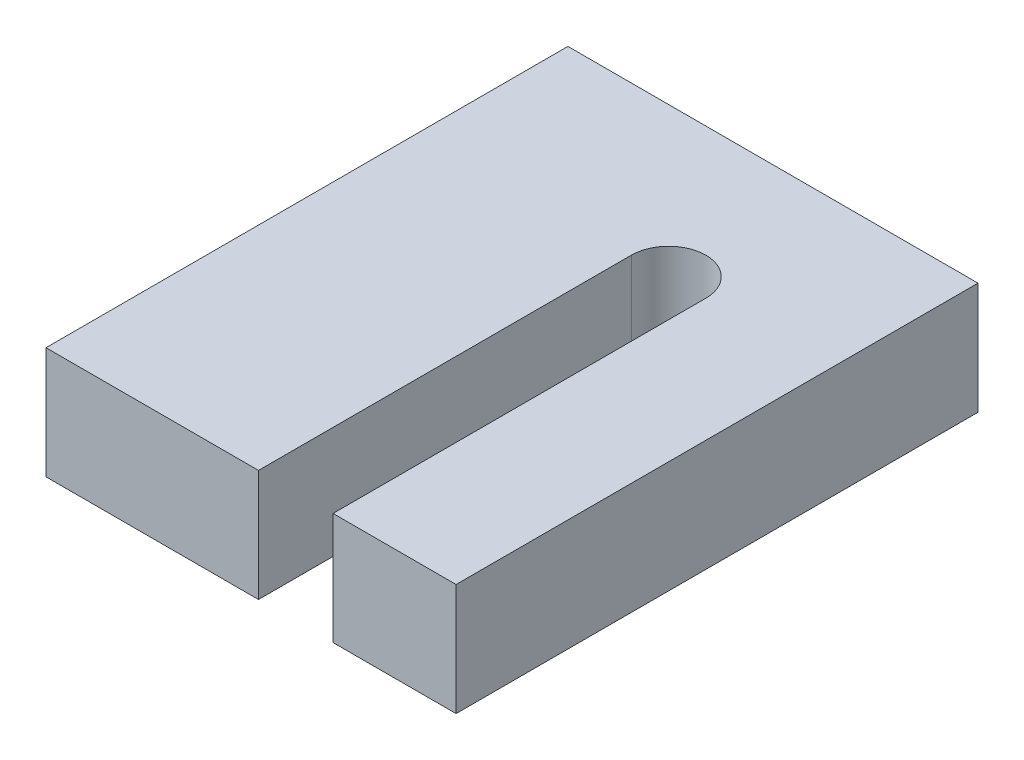
ISO-10303-21;
HEADER;
FILE_DESCRIPTION(('STEP AP214'),'2;1');
FILE_NAME('part.step','',(''),(''),'','','');
FILE_SCHEMA(('AUTOMOTIVE_DESIGN { 1 0 10303 214 1 1 1 1 }'));
ENDSEC;
DATA;
#1=APPLICATION_CONTEXT('core data for automotive mechanical design processes');
#2=APPLICATION_PROTOCOL_DEFINITION('international standard','automotive_design',2000,#1);
#3=PRODUCT_CONTEXT('',#1,'mechanical');
#4=PRODUCT('Part','Part','',(#3));
#5=PRODUCT_RELATED_PRODUCT_CATEGORY('part','',(#4));
#6=PRODUCT_DEFINITION_FORMATION('','',#4);
#7=PRODUCT_DEFINITION_CONTEXT('part definition',#1,'design');
#8=PRODUCT_DEFINITION('design','',#6,#7);
#9=PRODUCT_DEFINITION_SHAPE('','',#8);
#10=(LENGTH_UNIT() NAMED_UNIT(*) SI_UNIT(.MILLI.,.METRE.));
#11=(NAMED_UNIT(*) PLANE_ANGLE_UNIT() SI_UNIT($,.RADIAN.));
#12=(NAMED_UNIT(*) SI_UNIT($,.STERADIAN.) SOLID_ANGLE_UNIT());
#13=UNCERTAINTY_MEASURE_WITH_UNIT(LENGTH_MEASURE(1.E-05),#10,'distance_accuracy_value','');
#14=(GEOMETRIC_REPRESENTATION_CONTEXT(3) GLOBAL_UNCERTAINTY_ASSIGNED_CONTEXT((#13)) GLOBAL_UNIT_ASSIGNED_CONTEXT((#10,
#11,#12)) REPRESENTATION_CONTEXT('',''));
#15=CARTESIAN_POINT('',(0.,0.,0.));
#16=DIRECTION('',(0.,0.,1.));
#17=DIRECTION('',(1.,0.,0.));
#18=AXIS2_PLACEMENT_3D('',#15,#16,#17);
#19=CARTESIAN_POINT('',(28.5,0.,-15.));
#20=DIRECTION('',(-1.,0.,0.));
#21=DIRECTION('',(0.,0.,1.));
#22=AXIS2_PLACEMENT_3D('',#19,#20,#21);
#23=PLANE('',#22);
#24=DIRECTION('',(0.,0.,1.));
#25=VECTOR('',#24,1.);
#26=CARTESIAN_POINT('',(28.5,-92.5,10.));
#27=LINE('',#26,#25);
#28=CARTESIAN_POINT('',(28.5,-92.5,-15.));
#29=VERTEX_POINT('',#28);
#30=CARTESIAN_POINT('',(28.5,-92.5,35.));
#31=VERTEX_POINT('',#30);
#32=EDGE_CURVE('E40',#29,#31,#27,.T.);
#33=ORIENTED_EDGE('',*,*,#32,.F.);
#34=DIRECTION('',(0.,1.,0.));
#35=VECTOR('',#34,1.);
#36=CARTESIAN_POINT('',(28.5,0.,-15.));
#37=LINE('',#36,#35);
#38=CARTESIAN_POINT('',(28.5,-77.5,-15.));
#39=VERTEX_POINT('',#38);
#40=EDGE_CURVE('E11',#29,#39,#37,.T.);
#41=ORIENTED_EDGE('',*,*,#40,.T.);
#42=DIRECTION('',(0.,0.,-1.));
#43=VECTOR('',#42,1.);
#44=CARTESIAN_POINT('',(28.5,-77.5,-25.));
#45=LINE('',#44,#43);
#46=CARTESIAN_POINT('',(28.5,-77.5,35.));
#47=VERTEX_POINT('',#46);
#48=EDGE_CURVE('E158',#47,#39,#45,.T.);
#49=ORIENTED_EDGE('',*,*,#48,.F.);
#50=DIRECTION('',(0.,1.,0.));
#51=VECTOR('',#50,1.);
#52=CARTESIAN_POINT('',(28.5,-38.75,35.));
#53=LINE('',#52,#51);
#54=EDGE_CURVE('E128',#31,#47,#53,.T.);
#55=ORIENTED_EDGE('',*,*,#54,.F.);
#56=EDGE_LOOP('',(#33,#41,#49,#55));
#57=FACE_BOUND('',#56,.T.);
#58=ADVANCED_FACE('F16',(#57),#23,.F.);
#59=CARTESIAN_POINT('',(33.5,0.,-15.));
#60=DIRECTION('',(0.,1.,0.));
#61=DIRECTION('',(1.,0.,0.));
#62=AXIS2_PLACEMENT_3D('',#59,#60,#61);
#63=CYLINDRICAL_SURFACE('',#62,5.);
#64=CARTESIAN_POINT('',(33.5,-92.5,-15.));
#65=DIRECTION('',(0.,1.,0.));
#66=DIRECTION('',(1.,0.,0.));
#67=AXIS2_PLACEMENT_3D('',#64,#65,#66);
#68=CIRCLE('',#67,5.);
#69=CARTESIAN_POINT('',(38.5,-92.5,-15.));
#70=VERTEX_POINT('',#69);
#71=EDGE_CURVE('E136',#70,#29,#68,.T.);
#72=ORIENTED_EDGE('',*,*,#71,.F.);
#73=DIRECTION('',(0.,1.,0.));
#74=VECTOR('',#73,1.);
#75=CARTESIAN_POINT('',(38.5,0.,-15.));
#76=LINE('',#75,#74);
#77=CARTESIAN_POINT('',(38.5,-77.5,-15.));
#78=VERTEX_POINT('',#77);
#79=EDGE_CURVE('E27',#70,#78,#76,.T.);
#80=ORIENTED_EDGE('',*,*,#79,.T.);
#81=CARTESIAN_POINT('',(33.5,-77.5,-15.));
#82=DIRECTION('',(0.,-1.,0.));
#83=DIRECTION('',(1.,0.,0.));
#84=AXIS2_PLACEMENT_3D('',#81,#82,#83);
#85=CIRCLE('',#84,5.);
#86=EDGE_CURVE('E98',#39,#78,#85,.T.);
#87=ORIENTED_EDGE('',*,*,#86,.F.);
#88=ORIENTED_EDGE('',*,*,#40,.F.);
#89=EDGE_LOOP('',(#72,#80,#87,#88));
#90=FACE_BOUND('',#89,.T.);
#91=ADVANCED_FACE('F306',(#90),#63,.F.);
#92=CARTESIAN_POINT('',(38.5,0.,85.));
#93=DIRECTION('',(1.,0.,0.));
#94=DIRECTION('',(0.,0.,-1.));
#95=AXIS2_PLACEMENT_3D('',#92,#93,#94);
#96=PLANE('',#95);
#97=DIRECTION('',(0.,0.,-1.));
#98=VECTOR('',#97,1.);
#99=CARTESIAN_POINT('',(38.5,-92.5,60.));
#100=LINE('',#99,#98);
#101=CARTESIAN_POINT('',(38.5,-92.5,35.));
#102=VERTEX_POINT('',#101);
#103=EDGE_CURVE('E87',#102,#70,#100,.T.);
#104=ORIENTED_EDGE('',*,*,#103,.F.);
#105=DIRECTION('',(0.,-1.,0.));
#106=VECTOR('',#105,1.);
#107=CARTESIAN_POINT('',(38.5,-38.75,35.));
#108=LINE('',#107,#106);
#109=CARTESIAN_POINT('',(38.5,-77.5,35.));
#110=VERTEX_POINT('',#109);
#111=EDGE_CURVE('E125',#110,#102,#108,.T.);
#112=ORIENTED_EDGE('',*,*,#111,.F.);
#113=DIRECTION('',(0.,0.,1.));
#114=VECTOR('',#113,1.);
#115=CARTESIAN_POINT('',(38.5,-77.5,25.));
#116=LINE('',#115,#114);
#117=EDGE_CURVE('E153',#78,#110,#116,.T.);
#118=ORIENTED_EDGE('',*,*,#117,.F.);
#119=ORIENTED_EDGE('',*,*,#79,.F.);
#120=EDGE_LOOP('',(#104,#112,#118,#119));
#121=FACE_BOUND('',#120,.T.);
#122=ADVANCED_FACE('F311',(#121),#96,.F.);
#123=CARTESIAN_POINT('',(0.,-77.5,-35.));
#124=DIRECTION('',(0.,1.,0.));
#125=DIRECTION('',(1.,0.,0.));
#126=AXIS2_PLACEMENT_3D('',#123,#124,#125);
#127=PLANE('',#126);
#128=ORIENTED_EDGE('',*,*,#48,.T.);
#129=ORIENTED_EDGE('',*,*,#86,.T.);
#130=ORIENTED_EDGE('',*,*,#117,.T.);
#131=DIRECTION('',(1.,0.,0.));
#132=VECTOR('',#131,1.);
#133=CARTESIAN_POINT('',(0.,-77.5,35.));
#134=LINE('',#133,#132);
#135=CARTESIAN_POINT('',(55.,-77.5,35.));
#136=VERTEX_POINT('',#135);
#137=EDGE_CURVE('E150',#110,#136,#134,.T.);
#138=ORIENTED_EDGE('',*,*,#137,.T.);
#139=DIRECTION('',(0.,0.,1.));
#140=VECTOR('',#139,1.);
#141=CARTESIAN_POINT('',(55.,-77.5,35.));
#142=LINE('',#141,#140);
#143=CARTESIAN_POINT('',(55.,-77.5,-35.));
#144=VERTEX_POINT('',#143);
#145=EDGE_CURVE('E115',#144,#136,#142,.T.);
#146=ORIENTED_EDGE('',*,*,#145,.F.);
#147=DIRECTION('',(1.,0.,0.));
#148=VECTOR('',#147,1.);
#149=CARTESIAN_POINT('',(0.,-77.5,-35.));
#150=LINE('',#149,#148);
#151=CARTESIAN_POINT('',(0.,-77.5,-35.));
#152=VERTEX_POINT('',#151);
#153=EDGE_CURVE('E156',#152,#144,#150,.T.);
#154=ORIENTED_EDGE('',*,*,#153,.F.);
#155=DIRECTION('',(0.,0.,-1.));
#156=VECTOR('',#155,1.);
#157=CARTESIAN_POINT('',(0.,-77.5,35.));
#158=LINE('',#157,#156);
#159=CARTESIAN_POINT('',(0.,-77.5,35.));
#160=VERTEX_POINT('',#159);
#161=EDGE_CURVE('E120',#160,#152,#158,.T.);
#162=ORIENTED_EDGE('',*,*,#161,.F.);
#163=DIRECTION('',(1.,0.,0.));
#164=VECTOR('',#163,1.);
#165=CARTESIAN_POINT('',(0.,-77.5,35.));
#166=LINE('',#165,#164);
#167=EDGE_CURVE('E154',#160,#47,#166,.T.);
#168=ORIENTED_EDGE('',*,*,#167,.T.);
#169=EDGE_LOOP('',(#128,#129,#130,#138,#146,#154,#162,#168));
#170=FACE_BOUND('',#169,.T.);
#171=ADVANCED_FACE('F194',(#170),#127,.T.);
#172=CARTESIAN_POINT('',(0.,-77.5,35.));
#173=DIRECTION('',(0.,0.,1.));
#174=DIRECTION('',(1.,0.,0.));
#175=AXIS2_PLACEMENT_3D('',#172,#173,#174);
#176=PLANE('',#175);
#177=ORIENTED_EDGE('',*,*,#111,.T.);
#178=DIRECTION('',(1.,0.,0.));
#179=VECTOR('',#178,1.);
#180=CARTESIAN_POINT('',(0.,-92.5,35.));
#181=LINE('',#180,#179);
#182=CARTESIAN_POINT('',(55.,-92.5,35.));
#183=VERTEX_POINT('',#182);
#184=EDGE_CURVE('E123',#102,#183,#181,.T.);
#185=ORIENTED_EDGE('',*,*,#184,.T.);
#186=DIRECTION('',(0.,-1.,0.));
#187=VECTOR('',#186,1.);
#188=CARTESIAN_POINT('',(55.,92.5,35.));
#189=LINE('',#188,#187);
#190=EDGE_CURVE('E108',#136,#183,#189,.T.);
#191=ORIENTED_EDGE('',*,*,#190,.F.);
#192=ORIENTED_EDGE('',*,*,#137,.F.);
#193=EDGE_LOOP('',(#177,#185,#191,#192));
#194=FACE_BOUND('',#193,.T.);
#195=ADVANCED_FACE('F124',(#194),#176,.T.);
#196=CARTESIAN_POINT('',(0.,-77.5,35.));
#197=DIRECTION('',(0.,0.,1.));
#198=DIRECTION('',(1.,0.,0.));
#199=AXIS2_PLACEMENT_3D('',#196,#197,#198);
#200=PLANE('',#199);
#201=ORIENTED_EDGE('',*,*,#54,.T.);
#202=ORIENTED_EDGE('',*,*,#167,.F.);
#203=DIRECTION('',(0.,-1.,0.));
#204=VECTOR('',#203,1.);
#205=CARTESIAN_POINT('',(0.,92.5,35.));
#206=LINE('',#205,#204);
#207=CARTESIAN_POINT('',(0.,-92.5,35.));
#208=VERTEX_POINT('',#207);
#209=EDGE_CURVE('E168',#160,#208,#206,.T.);
#210=ORIENTED_EDGE('',*,*,#209,.T.);
#211=DIRECTION('',(1.,0.,0.));
#212=VECTOR('',#211,1.);
#213=CARTESIAN_POINT('',(0.,-92.5,35.));
#214=LINE('',#213,#212);
#215=EDGE_CURVE('E165',#208,#31,#214,.T.);
#216=ORIENTED_EDGE('',*,*,#215,.T.);
#217=EDGE_LOOP('',(#201,#202,#210,#216));
#218=FACE_BOUND('',#217,.T.);
#219=ADVANCED_FACE('F281',(#218),#200,.T.);
#220=CARTESIAN_POINT('',(0.,-92.5,-35.));
#221=DIRECTION('',(0.,0.,-1.));
#222=DIRECTION('',(0.,-1.,0.));
#223=AXIS2_PLACEMENT_3D('',#220,#221,#222);
#224=PLANE('',#223);
#225=DIRECTION('',(0.,1.,0.));
#226=VECTOR('',#225,1.);
#227=CARTESIAN_POINT('',(0.,-92.5,-35.));
#228=LINE('',#227,#226);
#229=CARTESIAN_POINT('',(0.,-92.5,-35.));
#230=VERTEX_POINT('',#229);
#231=EDGE_CURVE('E164',#230,#152,#228,.T.);
#232=ORIENTED_EDGE('',*,*,#231,.T.);
#233=ORIENTED_EDGE('',*,*,#153,.T.);
#234=DIRECTION('',(0.,1.,0.));
#235=VECTOR('',#234,1.);
#236=CARTESIAN_POINT('',(55.,-92.5,-35.));
#237=LINE('',#236,#235);
#238=CARTESIAN_POINT('',(55.,-92.5,-35.));
#239=VERTEX_POINT('',#238);
#240=EDGE_CURVE('E137',#239,#144,#237,.T.);
#241=ORIENTED_EDGE('',*,*,#240,.F.);
#242=DIRECTION('',(1.,0.,0.));
#243=VECTOR('',#242,1.);
#244=CARTESIAN_POINT('',(0.,-92.5,-35.));
#245=LINE('',#244,#243);
#246=EDGE_CURVE('E134',#230,#239,#245,.T.);
#247=ORIENTED_EDGE('',*,*,#246,.F.);
#248=EDGE_LOOP('',(#232,#233,#241,#247));
#249=FACE_BOUND('',#248,.T.);
#250=ADVANCED_FACE('F195',(#249),#224,.T.);
#251=CARTESIAN_POINT('',(0.,-92.5,35.));
#252=DIRECTION('',(0.,-1.,0.));
#253=DIRECTION('',(0.,0.,-1.));
#254=AXIS2_PLACEMENT_3D('',#251,#252,#253);
#255=PLANE('',#254);
#256=ORIENTED_EDGE('',*,*,#32,.T.);
#257=ORIENTED_EDGE('',*,*,#215,.F.);
#258=DIRECTION('',(0.,0.,-1.));
#259=VECTOR('',#258,1.);
#260=CARTESIAN_POINT('',(0.,-92.5,35.));
#261=LINE('',#260,#259);
#262=EDGE_CURVE('E20',#208,#230,#261,.T.);
#263=ORIENTED_EDGE('',*,*,#262,.T.);
#264=ORIENTED_EDGE('',*,*,#246,.T.);
#265=DIRECTION('',(0.,0.,-1.));
#266=VECTOR('',#265,1.);
#267=CARTESIAN_POINT('',(55.,-92.5,35.));
#268=LINE('',#267,#266);
#269=EDGE_CURVE('E113',#183,#239,#268,.T.);
#270=ORIENTED_EDGE('',*,*,#269,.F.);
#271=ORIENTED_EDGE('',*,*,#184,.F.);
#272=ORIENTED_EDGE('',*,*,#103,.T.);
#273=ORIENTED_EDGE('',*,*,#71,.T.);
#274=EDGE_LOOP('',(#256,#257,#263,#264,#270,#271,#272,#273));
#275=FACE_BOUND('',#274,.T.);
#276=ADVANCED_FACE('F131',(#275),#255,.T.);
#277=CARTESIAN_POINT('',(55.,-85.,0.));
#278=DIRECTION('',(1.,0.,0.));
#279=DIRECTION('',(0.,1.,0.));
#280=AXIS2_PLACEMENT_3D('',#277,#278,#279);
#281=PLANE('',#280);
#282=ORIENTED_EDGE('',*,*,#269,.T.);
#283=ORIENTED_EDGE('',*,*,#240,.T.);
#284=ORIENTED_EDGE('',*,*,#145,.T.);
#285=ORIENTED_EDGE('',*,*,#190,.T.);
#286=EDGE_LOOP('',(#282,#283,#284,#285));
#287=FACE_BOUND('',#286,.T.);
#288=ADVANCED_FACE('F110',(#287),#281,.T.);
#289=CARTESIAN_POINT('',(0.,-85.,0.));
#290=DIRECTION('',(1.,0.,0.));
#291=DIRECTION('',(0.,1.,0.));
#292=AXIS2_PLACEMENT_3D('',#289,#290,#291);
#293=PLANE('',#292);
#294=ORIENTED_EDGE('',*,*,#262,.F.);
#295=ORIENTED_EDGE('',*,*,#209,.F.);
#296=ORIENTED_EDGE('',*,*,#161,.T.);
#297=ORIENTED_EDGE('',*,*,#231,.F.);
#298=EDGE_LOOP('',(#294,#295,#296,#297));
#299=FACE_BOUND('',#298,.T.);
#300=ADVANCED_FACE('F18',(#299),#293,.F.);
#301=CLOSED_SHELL('',(#58,#91,#122,#171,#195,#219,#250,#276,#288,#300));
#302=MANIFOLD_SOLID_BREP('B1',#301);
#303=ADVANCED_BREP_SHAPE_REPRESENTATION('',(#18,#302),#14);
#304=SHAPE_DEFINITION_REPRESENTATION(#9,#303);
ENDSEC;
END-ISO-10303-21;
